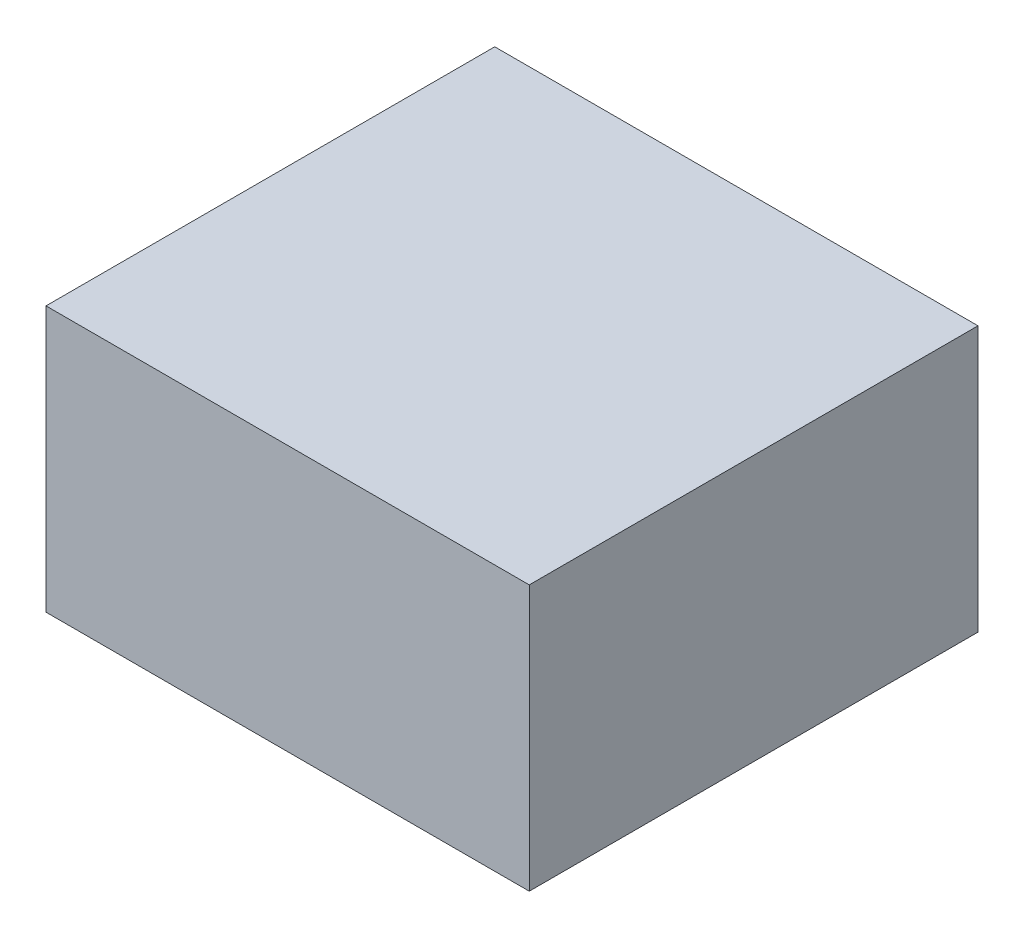
ISO-10303-21;
HEADER;
FILE_DESCRIPTION(('STEP AP214'),'2;1');
FILE_NAME('part.step','',(''),(''),'','','');
FILE_SCHEMA(('AUTOMOTIVE_DESIGN { 1 0 10303 214 1 1 1 1 }'));
ENDSEC;
DATA;
#1=APPLICATION_CONTEXT('core data for automotive mechanical design processes');
#2=APPLICATION_PROTOCOL_DEFINITION('international standard','automotive_design',2000,#1);
#3=PRODUCT_CONTEXT('',#1,'mechanical');
#4=PRODUCT('Part','Part','',(#3));
#5=PRODUCT_RELATED_PRODUCT_CATEGORY('part','',(#4));
#6=PRODUCT_DEFINITION_FORMATION('','',#4);
#7=PRODUCT_DEFINITION_CONTEXT('part definition',#1,'design');
#8=PRODUCT_DEFINITION('design','',#6,#7);
#9=PRODUCT_DEFINITION_SHAPE('','',#8);
#10=(LENGTH_UNIT() NAMED_UNIT(*) SI_UNIT(.MILLI.,.METRE.));
#11=(NAMED_UNIT(*) PLANE_ANGLE_UNIT() SI_UNIT($,.RADIAN.));
#12=(NAMED_UNIT(*) SI_UNIT($,.STERADIAN.) SOLID_ANGLE_UNIT());
#13=UNCERTAINTY_MEASURE_WITH_UNIT(LENGTH_MEASURE(1.E-05),#10,'distance_accuracy_value','');
#14=(GEOMETRIC_REPRESENTATION_CONTEXT(3) GLOBAL_UNCERTAINTY_ASSIGNED_CONTEXT((#13)) GLOBAL_UNIT_ASSIGNED_CONTEXT((#10,
#11,#12)) REPRESENTATION_CONTEXT('',''));
#15=CARTESIAN_POINT('',(0.,0.,0.));
#16=DIRECTION('',(0.,0.,1.));
#17=DIRECTION('',(1.,0.,0.));
#18=AXIS2_PLACEMENT_3D('',#15,#16,#17);
#19=CARTESIAN_POINT('',(4.90000036,2.6899997,0.));
#20=DIRECTION('',(0.,-1.,0.));
#21=DIRECTION('',(0.,0.,-1.));
#22=AXIS2_PLACEMENT_3D('',#19,#20,#21);
#23=PLANE('',#22);
#24=DIRECTION('',(0.,0.,-1.));
#25=VECTOR('',#24,1.);
#26=CARTESIAN_POINT('',(-4.90000036,2.6899997,0.));
#27=LINE('',#26,#25);
#28=CARTESIAN_POINT('',(-4.90000036,2.6899997,0.));
#29=VERTEX_POINT('',#28);
#30=CARTESIAN_POINT('',(-4.90000036,2.6899997,9.09999958));
#31=VERTEX_POINT('',#30);
#32=EDGE_CURVE('E20',#29,#31,#27,.F.);
#33=ORIENTED_EDGE('',*,*,#32,.T.);
#34=DIRECTION('',(-1.,0.,0.));
#35=VECTOR('',#34,1.);
#36=CARTESIAN_POINT('',(-4.90000036,2.6899997,9.09999958));
#37=LINE('',#36,#35);
#38=CARTESIAN_POINT('',(4.90000036,2.6899997,9.09999958));
#39=VERTEX_POINT('',#38);
#40=EDGE_CURVE('E55',#31,#39,#37,.F.);
#41=ORIENTED_EDGE('',*,*,#40,.T.);
#42=DIRECTION('',(0.,0.,1.));
#43=VECTOR('',#42,1.);
#44=CARTESIAN_POINT('',(4.90000036,2.6899997,0.));
#45=LINE('',#44,#43);
#46=CARTESIAN_POINT('',(4.90000036,2.6899997,0.));
#47=VERTEX_POINT('',#46);
#48=EDGE_CURVE('E74',#39,#47,#45,.F.);
#49=ORIENTED_EDGE('',*,*,#48,.T.);
#50=DIRECTION('',(-1.,0.,0.));
#51=VECTOR('',#50,1.);
#52=CARTESIAN_POINT('',(-4.90000036,2.6899997,0.));
#53=LINE('',#52,#51);
#54=EDGE_CURVE('E66',#29,#47,#53,.F.);
#55=ORIENTED_EDGE('',*,*,#54,.F.);
#56=EDGE_LOOP('',(#33,#41,#49,#55));
#57=FACE_BOUND('',#56,.T.);
#58=ADVANCED_FACE('F17',(#57),#23,.F.);
#59=CARTESIAN_POINT('',(-4.90000036,2.6899997,0.));
#60=DIRECTION('',(1.,0.,0.));
#61=DIRECTION('',(0.,0.,-1.));
#62=AXIS2_PLACEMENT_3D('',#59,#60,#61);
#63=PLANE('',#62);
#64=DIRECTION('',(0.,0.,1.));
#65=VECTOR('',#64,1.);
#66=CARTESIAN_POINT('',(-4.90000036,-2.6899997,0.));
#67=LINE('',#66,#65);
#68=CARTESIAN_POINT('',(-4.90000036,-2.6899997,0.));
#69=VERTEX_POINT('',#68);
#70=CARTESIAN_POINT('',(-4.90000036,-2.6899997,9.09999958));
#71=VERTEX_POINT('',#70);
#72=EDGE_CURVE('E72',#69,#71,#67,.T.);
#73=ORIENTED_EDGE('',*,*,#72,.T.);
#74=DIRECTION('',(0.,1.,0.));
#75=VECTOR('',#74,1.);
#76=CARTESIAN_POINT('',(-4.90000036,2.6899997,9.09999958));
#77=LINE('',#76,#75);
#78=EDGE_CURVE('E62',#71,#31,#77,.T.);
#79=ORIENTED_EDGE('',*,*,#78,.T.);
#80=ORIENTED_EDGE('',*,*,#32,.F.);
#81=DIRECTION('',(0.,1.,0.));
#82=VECTOR('',#81,1.);
#83=CARTESIAN_POINT('',(-4.90000036,2.6899997,0.));
#84=LINE('',#83,#82);
#85=EDGE_CURVE('E80',#69,#29,#84,.T.);
#86=ORIENTED_EDGE('',*,*,#85,.F.);
#87=EDGE_LOOP('',(#73,#79,#80,#86));
#88=FACE_BOUND('',#87,.T.);
#89=ADVANCED_FACE('F71',(#88),#63,.F.);
#90=CARTESIAN_POINT('',(-4.90000036,2.6899997,9.09999958));
#91=DIRECTION('',(0.,0.,-1.));
#92=DIRECTION('',(-1.,0.,0.));
#93=AXIS2_PLACEMENT_3D('',#90,#91,#92);
#94=PLANE('',#93);
#95=DIRECTION('',(1.,0.,0.));
#96=VECTOR('',#95,1.);
#97=CARTESIAN_POINT('',(-4.90000036,-2.6899997,9.09999958));
#98=LINE('',#97,#96);
#99=CARTESIAN_POINT('',(4.90000036,-2.6899997,9.09999958));
#100=VERTEX_POINT('',#99);
#101=EDGE_CURVE('E83',#71,#100,#98,.T.);
#102=ORIENTED_EDGE('',*,*,#101,.T.);
#103=DIRECTION('',(0.,1.,0.));
#104=VECTOR('',#103,1.);
#105=CARTESIAN_POINT('',(4.90000036,-2.6899997,9.09999958));
#106=LINE('',#105,#104);
#107=EDGE_CURVE('E64',#100,#39,#106,.T.);
#108=ORIENTED_EDGE('',*,*,#107,.T.);
#109=ORIENTED_EDGE('',*,*,#40,.F.);
#110=ORIENTED_EDGE('',*,*,#78,.F.);
#111=EDGE_LOOP('',(#102,#108,#109,#110));
#112=FACE_BOUND('',#111,.T.);
#113=ADVANCED_FACE('F60',(#112),#94,.F.);
#114=CARTESIAN_POINT('',(4.90000036,-2.6899997,0.));
#115=DIRECTION('',(-1.,0.,0.));
#116=DIRECTION('',(0.,0.,1.));
#117=AXIS2_PLACEMENT_3D('',#114,#115,#116);
#118=PLANE('',#117);
#119=ORIENTED_EDGE('',*,*,#48,.F.);
#120=ORIENTED_EDGE('',*,*,#107,.F.);
#121=DIRECTION('',(0.,0.,1.));
#122=VECTOR('',#121,1.);
#123=CARTESIAN_POINT('',(4.90000036,-2.6899997,0.));
#124=LINE('',#123,#122);
#125=CARTESIAN_POINT('',(4.90000036,-2.6899997,0.));
#126=VERTEX_POINT('',#125);
#127=EDGE_CURVE('E26',#100,#126,#124,.F.);
#128=ORIENTED_EDGE('',*,*,#127,.T.);
#129=DIRECTION('',(0.,1.,0.));
#130=VECTOR('',#129,1.);
#131=CARTESIAN_POINT('',(4.90000036,2.6899997,0.));
#132=LINE('',#131,#130);
#133=EDGE_CURVE('E34',#47,#126,#132,.F.);
#134=ORIENTED_EDGE('',*,*,#133,.F.);
#135=EDGE_LOOP('',(#119,#120,#128,#134));
#136=FACE_BOUND('',#135,.T.);
#137=ADVANCED_FACE('F88',(#136),#118,.F.);
#138=CARTESIAN_POINT('',(-4.90000036,2.6899997,0.));
#139=DIRECTION('',(0.,0.,-1.));
#140=DIRECTION('',(-1.,0.,0.));
#141=AXIS2_PLACEMENT_3D('',#138,#139,#140);
#142=PLANE('',#141);
#143=DIRECTION('',(1.,0.,0.));
#144=VECTOR('',#143,1.);
#145=CARTESIAN_POINT('',(-4.90000036,-2.6899997,0.));
#146=LINE('',#145,#144);
#147=EDGE_CURVE('E11',#126,#69,#146,.F.);
#148=ORIENTED_EDGE('',*,*,#147,.T.);
#149=ORIENTED_EDGE('',*,*,#85,.T.);
#150=ORIENTED_EDGE('',*,*,#54,.T.);
#151=ORIENTED_EDGE('',*,*,#133,.T.);
#152=EDGE_LOOP('',(#148,#149,#150,#151));
#153=FACE_BOUND('',#152,.T.);
#154=ADVANCED_FACE('F91',(#153),#142,.T.);
#155=CARTESIAN_POINT('',(-4.90000036,-2.6899997,0.));
#156=DIRECTION('',(0.,1.,0.));
#157=DIRECTION('',(0.,0.,1.));
#158=AXIS2_PLACEMENT_3D('',#155,#156,#157);
#159=PLANE('',#158);
#160=ORIENTED_EDGE('',*,*,#127,.F.);
#161=ORIENTED_EDGE('',*,*,#101,.F.);
#162=ORIENTED_EDGE('',*,*,#72,.F.);
#163=ORIENTED_EDGE('',*,*,#147,.F.);
#164=EDGE_LOOP('',(#160,#161,#162,#163));
#165=FACE_BOUND('',#164,.T.);
#166=ADVANCED_FACE('F90',(#165),#159,.F.);
#167=CLOSED_SHELL('',(#58,#89,#113,#137,#154,#166));
#168=MANIFOLD_SOLID_BREP('B1',#167);
#169=ADVANCED_BREP_SHAPE_REPRESENTATION('',(#18,#168),#14);
#170=SHAPE_DEFINITION_REPRESENTATION(#9,#169);
ENDSEC;
END-ISO-10303-21;
